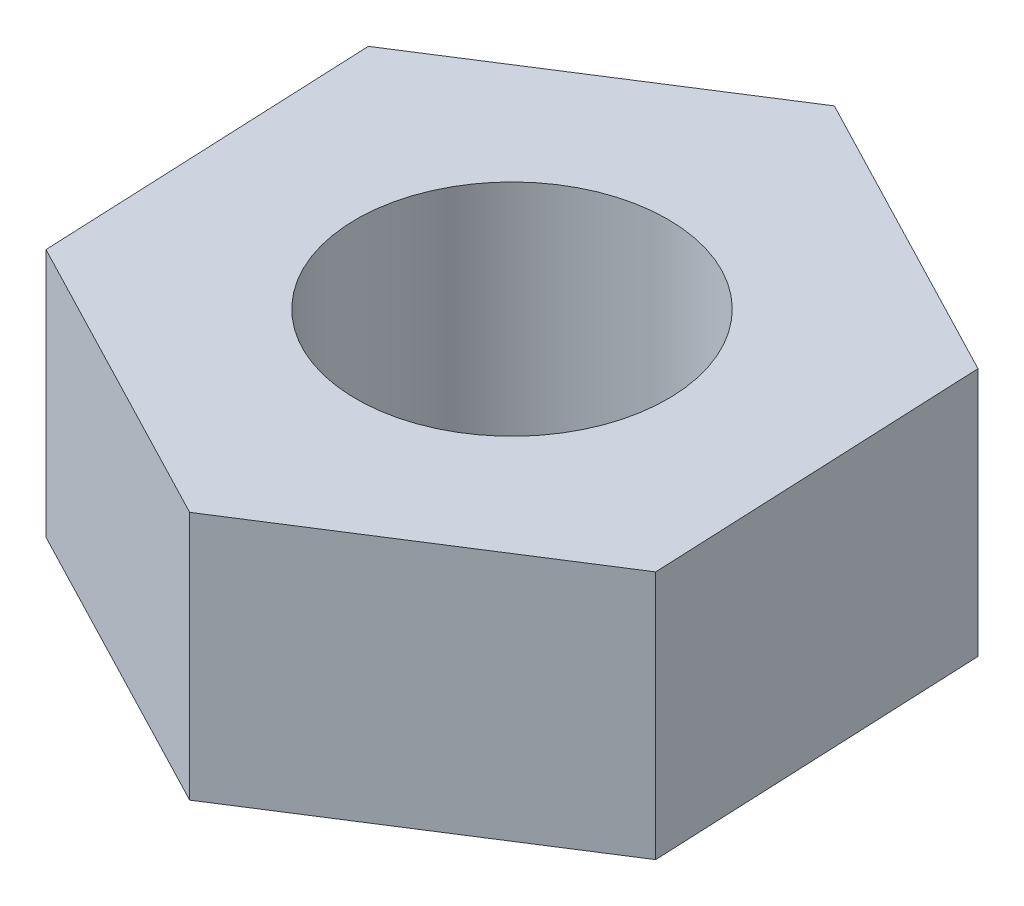
ISO-10303-21;
HEADER;
FILE_DESCRIPTION(('STEP AP214'),'2;1');
FILE_NAME('part.step','',(''),(''),'','','');
FILE_SCHEMA(('AUTOMOTIVE_DESIGN { 1 0 10303 214 1 1 1 1 }'));
ENDSEC;
DATA;
#1=APPLICATION_CONTEXT('core data for automotive mechanical design processes');
#2=APPLICATION_PROTOCOL_DEFINITION('international standard','automotive_design',2000,#1);
#3=PRODUCT_CONTEXT('',#1,'mechanical');
#4=PRODUCT('Part','Part','',(#3));
#5=PRODUCT_RELATED_PRODUCT_CATEGORY('part','',(#4));
#6=PRODUCT_DEFINITION_FORMATION('','',#4);
#7=PRODUCT_DEFINITION_CONTEXT('part definition',#1,'design');
#8=PRODUCT_DEFINITION('design','',#6,#7);
#9=PRODUCT_DEFINITION_SHAPE('','',#8);
#10=(LENGTH_UNIT() NAMED_UNIT(*) SI_UNIT(.MILLI.,.METRE.));
#11=(NAMED_UNIT(*) PLANE_ANGLE_UNIT() SI_UNIT($,.RADIAN.));
#12=(NAMED_UNIT(*) SI_UNIT($,.STERADIAN.) SOLID_ANGLE_UNIT());
#13=UNCERTAINTY_MEASURE_WITH_UNIT(LENGTH_MEASURE(1.E-05),#10,'distance_accuracy_value','');
#14=(GEOMETRIC_REPRESENTATION_CONTEXT(3) GLOBAL_UNCERTAINTY_ASSIGNED_CONTEXT((#13)) GLOBAL_UNIT_ASSIGNED_CONTEXT((#10,
#11,#12)) REPRESENTATION_CONTEXT('',''));
#15=CARTESIAN_POINT('',(0.,0.,0.));
#16=DIRECTION('',(0.,0.,1.));
#17=DIRECTION('',(1.,0.,0.));
#18=AXIS2_PLACEMENT_3D('',#15,#16,#17);
#19=CARTESIAN_POINT('',(-0.285815994218681,4.8,-6.49371305321147));
#20=DIRECTION('',(-0.461435786892992,0.,0.887173610165702));
#21=DIRECTION('',(-0.887173610165703,0.,-0.461435786892992));
#22=AXIS2_PLACEMENT_3D('',#19,#20,#21);
#23=PLANE('',#22);
#24=DIRECTION('',(0.887173610165702,0.,0.461435786892992));
#25=VECTOR('',#24,1.);
#26=CARTESIAN_POINT('',(-0.285815994218681,0.,-6.49371305321147));
#27=LINE('',#26,#25);
#28=CARTESIAN_POINT('',(-0.285815994218681,0.,-6.49371305321147));
#29=VERTEX_POINT('',#28);
#30=CARTESIAN_POINT('',(5.4808124718584,0.,-3.49438043840702));
#31=VERTEX_POINT('',#30);
#32=EDGE_CURVE('E119',#29,#31,#27,.T.);
#33=ORIENTED_EDGE('',*,*,#32,.F.);
#34=DIRECTION('',(0.,-1.,0.));
#35=VECTOR('',#34,1.);
#36=CARTESIAN_POINT('',(-0.285815994218681,4.8,-6.49371305321147));
#37=LINE('',#36,#35);
#38=CARTESIAN_POINT('',(-0.285815994218681,4.8,-6.49371305321147));
#39=VERTEX_POINT('',#38);
#40=EDGE_CURVE('E118',#39,#29,#37,.T.);
#41=ORIENTED_EDGE('',*,*,#40,.F.);
#42=DIRECTION('',(0.887173610165702,0.,0.461435786892992));
#43=VECTOR('',#42,1.);
#44=CARTESIAN_POINT('',(-0.285815994218681,4.8,-6.49371305321147));
#45=LINE('',#44,#43);
#46=CARTESIAN_POINT('',(5.4808124718584,4.8,-3.49438043840702));
#47=VERTEX_POINT('',#46);
#48=EDGE_CURVE('E131',#39,#47,#45,.T.);
#49=ORIENTED_EDGE('',*,*,#48,.T.);
#50=DIRECTION('',(0.,-1.,0.));
#51=VECTOR('',#50,1.);
#52=CARTESIAN_POINT('',(5.4808124718584,4.8,-3.49438043840702));
#53=LINE('',#52,#51);
#54=EDGE_CURVE('E11',#47,#31,#53,.T.);
#55=ORIENTED_EDGE('',*,*,#54,.T.);
#56=EDGE_LOOP('',(#33,#41,#49,#55));
#57=FACE_BOUND('',#56,.T.);
#58=ADVANCED_FACE('F35',(#57),#23,.F.);
#59=CARTESIAN_POINT('',(5.4808124718584,4.8,-3.49438043840702));
#60=DIRECTION('',(-0.999032777417146,0.,0.0439716914182564));
#61=DIRECTION('',(-0.0439716914182564,0.,-0.999032777417147));
#62=AXIS2_PLACEMENT_3D('',#59,#60,#61);
#63=PLANE('',#62);
#64=DIRECTION('',(0.0439716914182564,0.,0.999032777417146));
#65=VECTOR('',#64,1.);
#66=CARTESIAN_POINT('',(5.4808124718584,0.,-3.49438043840702));
#67=LINE('',#66,#65);
#68=CARTESIAN_POINT('',(5.76662846607707,0.,2.99933261480445));
#69=VERTEX_POINT('',#68);
#70=EDGE_CURVE('E121',#31,#69,#67,.T.);
#71=ORIENTED_EDGE('',*,*,#70,.F.);
#72=ORIENTED_EDGE('',*,*,#54,.F.);
#73=DIRECTION('',(0.0439716914182564,0.,0.999032777417146));
#74=VECTOR('',#73,1.);
#75=CARTESIAN_POINT('',(5.4808124718584,4.8,-3.49438043840702));
#76=LINE('',#75,#74);
#77=CARTESIAN_POINT('',(5.76662846607707,4.8,2.99933261480445));
#78=VERTEX_POINT('',#77);
#79=EDGE_CURVE('E84',#47,#78,#76,.T.);
#80=ORIENTED_EDGE('',*,*,#79,.T.);
#81=DIRECTION('',(0.,-1.,0.));
#82=VECTOR('',#81,1.);
#83=CARTESIAN_POINT('',(5.76662846607707,4.8,2.99933261480445));
#84=LINE('',#83,#82);
#85=EDGE_CURVE('E44',#78,#69,#84,.T.);
#86=ORIENTED_EDGE('',*,*,#85,.T.);
#87=EDGE_LOOP('',(#71,#72,#80,#86));
#88=FACE_BOUND('',#87,.T.);
#89=ADVANCED_FACE('F138',(#88),#63,.F.);
#90=CARTESIAN_POINT('',(5.76662846607707,4.8,2.99933261480445));
#91=DIRECTION('',(-0.537596990524155,0.,-0.843201918747444));
#92=DIRECTION('',(0.843201918747444,0.,-0.537596990524155));
#93=AXIS2_PLACEMENT_3D('',#90,#91,#92);
#94=PLANE('',#93);
#95=DIRECTION('',(-0.843201918747444,0.,0.537596990524155));
#96=VECTOR('',#95,1.);
#97=CARTESIAN_POINT('',(5.76662846607707,0.,2.99933261480445));
#98=LINE('',#97,#96);
#99=CARTESIAN_POINT('',(0.285815994218677,0.,6.49371305321146));
#100=VERTEX_POINT('',#99);
#101=EDGE_CURVE('E124',#69,#100,#98,.T.);
#102=ORIENTED_EDGE('',*,*,#101,.F.);
#103=ORIENTED_EDGE('',*,*,#85,.F.);
#104=DIRECTION('',(-0.843201918747444,0.,0.537596990524155));
#105=VECTOR('',#104,1.);
#106=CARTESIAN_POINT('',(5.76662846607707,4.8,2.99933261480445));
#107=LINE('',#106,#105);
#108=CARTESIAN_POINT('',(0.285815994218677,4.8,6.49371305321146));
#109=VERTEX_POINT('',#108);
#110=EDGE_CURVE('E112',#78,#109,#107,.T.);
#111=ORIENTED_EDGE('',*,*,#110,.T.);
#112=DIRECTION('',(0.,-1.,0.));
#113=VECTOR('',#112,1.);
#114=CARTESIAN_POINT('',(0.285815994218677,4.8,6.49371305321146));
#115=LINE('',#114,#113);
#116=EDGE_CURVE('E106',#109,#100,#115,.T.);
#117=ORIENTED_EDGE('',*,*,#116,.T.);
#118=EDGE_LOOP('',(#102,#103,#111,#117));
#119=FACE_BOUND('',#118,.T.);
#120=ADVANCED_FACE('F171',(#119),#94,.F.);
#121=CARTESIAN_POINT('',(0.285815994218677,4.8,6.49371305321146));
#122=DIRECTION('',(0.461435786892992,0.,-0.887173610165702));
#123=DIRECTION('',(0.887173610165702,0.,0.461435786892992));
#124=AXIS2_PLACEMENT_3D('',#121,#122,#123);
#125=PLANE('',#124);
#126=DIRECTION('',(-0.887173610165702,0.,-0.461435786892992));
#127=VECTOR('',#126,1.);
#128=CARTESIAN_POINT('',(0.285815994218677,0.,6.49371305321146));
#129=LINE('',#128,#127);
#130=CARTESIAN_POINT('',(-5.48081247185839,0.,3.49438043840701));
#131=VERTEX_POINT('',#130);
#132=EDGE_CURVE('E127',#100,#131,#129,.T.);
#133=ORIENTED_EDGE('',*,*,#132,.F.);
#134=ORIENTED_EDGE('',*,*,#116,.F.);
#135=DIRECTION('',(-0.887173610165702,0.,-0.461435786892992));
#136=VECTOR('',#135,1.);
#137=CARTESIAN_POINT('',(0.285815994218677,4.8,6.49371305321146));
#138=LINE('',#137,#136);
#139=CARTESIAN_POINT('',(-5.48081247185839,4.8,3.49438043840701));
#140=VERTEX_POINT('',#139);
#141=EDGE_CURVE('E96',#109,#140,#138,.T.);
#142=ORIENTED_EDGE('',*,*,#141,.T.);
#143=DIRECTION('',(0.,-1.,0.));
#144=VECTOR('',#143,1.);
#145=CARTESIAN_POINT('',(-5.48081247185839,4.8,3.49438043840701));
#146=LINE('',#145,#144);
#147=EDGE_CURVE('E101',#140,#131,#146,.T.);
#148=ORIENTED_EDGE('',*,*,#147,.T.);
#149=EDGE_LOOP('',(#133,#134,#142,#148));
#150=FACE_BOUND('',#149,.T.);
#151=ADVANCED_FACE('F109',(#150),#125,.F.);
#152=CARTESIAN_POINT('',(-5.48081247185839,4.8,3.49438043840701));
#153=DIRECTION('',(0.999032777417146,0.,-0.0439716914182575));
#154=DIRECTION('',(0.0439716914182575,0.,0.999032777417146));
#155=AXIS2_PLACEMENT_3D('',#152,#153,#154);
#156=PLANE('',#155);
#157=DIRECTION('',(-0.0439716914182575,0.,-0.999032777417146));
#158=VECTOR('',#157,1.);
#159=CARTESIAN_POINT('',(-5.48081247185839,0.,3.49438043840701));
#160=LINE('',#159,#158);
#161=CARTESIAN_POINT('',(-5.76662846607707,0.,-2.99933261480446));
#162=VERTEX_POINT('',#161);
#163=EDGE_CURVE('E103',#131,#162,#160,.T.);
#164=ORIENTED_EDGE('',*,*,#163,.F.);
#165=ORIENTED_EDGE('',*,*,#147,.F.);
#166=DIRECTION('',(-0.0439716914182575,0.,-0.999032777417146));
#167=VECTOR('',#166,1.);
#168=CARTESIAN_POINT('',(-5.48081247185839,4.8,3.49438043840701));
#169=LINE('',#168,#167);
#170=CARTESIAN_POINT('',(-5.76662846607707,4.8,-2.99933261480446));
#171=VERTEX_POINT('',#170);
#172=EDGE_CURVE('E92',#140,#171,#169,.T.);
#173=ORIENTED_EDGE('',*,*,#172,.T.);
#174=DIRECTION('',(0.,-1.,0.));
#175=VECTOR('',#174,1.);
#176=CARTESIAN_POINT('',(-5.76662846607707,4.8,-2.99933261480446));
#177=LINE('',#176,#175);
#178=EDGE_CURVE('E107',#171,#162,#177,.T.);
#179=ORIENTED_EDGE('',*,*,#178,.T.);
#180=EDGE_LOOP('',(#164,#165,#173,#179));
#181=FACE_BOUND('',#180,.T.);
#182=ADVANCED_FACE('F102',(#181),#156,.F.);
#183=CARTESIAN_POINT('',(-5.76662846607707,4.8,-2.99933261480446));
#184=DIRECTION('',(0.537596990524156,0.,0.843201918747444));
#185=DIRECTION('',(-0.843201918747444,0.,0.537596990524156));
#186=AXIS2_PLACEMENT_3D('',#183,#184,#185);
#187=PLANE('',#186);
#188=DIRECTION('',(0.843201918747444,0.,-0.537596990524156));
#189=VECTOR('',#188,1.);
#190=CARTESIAN_POINT('',(-5.76662846607707,0.,-2.99933261480446));
#191=LINE('',#190,#189);
#192=EDGE_CURVE('E72',#162,#29,#191,.T.);
#193=ORIENTED_EDGE('',*,*,#192,.F.);
#194=ORIENTED_EDGE('',*,*,#178,.F.);
#195=DIRECTION('',(0.843201918747444,0.,-0.537596990524156));
#196=VECTOR('',#195,1.);
#197=CARTESIAN_POINT('',(-5.76662846607707,4.8,-2.99933261480446));
#198=LINE('',#197,#196);
#199=EDGE_CURVE('E52',#171,#39,#198,.T.);
#200=ORIENTED_EDGE('',*,*,#199,.T.);
#201=ORIENTED_EDGE('',*,*,#40,.T.);
#202=EDGE_LOOP('',(#193,#194,#200,#201));
#203=FACE_BOUND('',#202,.T.);
#204=ADVANCED_FACE('F164',(#203),#187,.F.);
#205=CARTESIAN_POINT('',(0.,4.8,0.));
#206=DIRECTION('',(0.,1.,0.));
#207=DIRECTION('',(0.,0.,-1.));
#208=AXIS2_PLACEMENT_3D('',#205,#206,#207);
#209=PLANE('',#208);
#210=CARTESIAN_POINT('',(0.,4.8,0.));
#211=DIRECTION('',(0.,-1.,0.));
#212=DIRECTION('',(0.,0.,-1.));
#213=AXIS2_PLACEMENT_3D('',#210,#211,#212);
#214=CIRCLE('',#213,3.);
#215=CARTESIAN_POINT('',(0.,4.8,-3.));
#216=VERTEX_POINT('',#215);
#217=EDGE_CURVE('E147',#216,#216,#214,.T.);
#218=ORIENTED_EDGE('',*,*,#217,.T.);
#219=EDGE_LOOP('',(#218));
#220=FACE_BOUND('',#219,.T.);
#221=ORIENTED_EDGE('',*,*,#48,.F.);
#222=ORIENTED_EDGE('',*,*,#199,.F.);
#223=ORIENTED_EDGE('',*,*,#172,.F.);
#224=ORIENTED_EDGE('',*,*,#141,.F.);
#225=ORIENTED_EDGE('',*,*,#110,.F.);
#226=ORIENTED_EDGE('',*,*,#79,.F.);
#227=EDGE_LOOP('',(#221,#222,#223,#224,#225,#226));
#228=FACE_BOUND('',#227,.T.);
#229=ADVANCED_FACE('F94',(#220,#228),#209,.T.);
#230=CARTESIAN_POINT('',(0.,0.,0.));
#231=DIRECTION('',(0.,1.,0.));
#232=DIRECTION('',(0.,0.,-1.));
#233=AXIS2_PLACEMENT_3D('',#230,#231,#232);
#234=PLANE('',#233);
#235=CARTESIAN_POINT('',(0.,0.,0.));
#236=DIRECTION('',(0.,-1.,0.));
#237=DIRECTION('',(0.,0.,-1.));
#238=AXIS2_PLACEMENT_3D('',#235,#236,#237);
#239=CIRCLE('',#238,3.);
#240=CARTESIAN_POINT('',(0.,0.,-3.));
#241=VERTEX_POINT('',#240);
#242=EDGE_CURVE('E38',#241,#241,#239,.T.);
#243=ORIENTED_EDGE('',*,*,#242,.F.);
#244=EDGE_LOOP('',(#243));
#245=FACE_BOUND('',#244,.T.);
#246=ORIENTED_EDGE('',*,*,#32,.T.);
#247=ORIENTED_EDGE('',*,*,#70,.T.);
#248=ORIENTED_EDGE('',*,*,#101,.T.);
#249=ORIENTED_EDGE('',*,*,#132,.T.);
#250=ORIENTED_EDGE('',*,*,#163,.T.);
#251=ORIENTED_EDGE('',*,*,#192,.T.);
#252=EDGE_LOOP('',(#246,#247,#248,#249,#250,#251));
#253=FACE_BOUND('',#252,.T.);
#254=ADVANCED_FACE('F140',(#245,#253),#234,.F.);
#255=CARTESIAN_POINT('',(0.,-0.7,0.));
#256=DIRECTION('',(0.,1.,0.));
#257=DIRECTION('',(0.,0.,-1.));
#258=AXIS2_PLACEMENT_3D('',#255,#256,#257);
#259=CYLINDRICAL_SURFACE('',#258,3.);
#260=ORIENTED_EDGE('',*,*,#217,.F.);
#261=EDGE_LOOP('',(#260));
#262=FACE_BOUND('',#261,.T.);
#263=ORIENTED_EDGE('',*,*,#242,.T.);
#264=EDGE_LOOP('',(#263));
#265=FACE_BOUND('',#264,.T.);
#266=ADVANCED_FACE('F154',(#262,#265),#259,.F.);
#267=CLOSED_SHELL('',(#58,#89,#120,#151,#182,#204,#229,#254,#266));
#268=MANIFOLD_SOLID_BREP('B2',#267);
#269=ADVANCED_BREP_SHAPE_REPRESENTATION('',(#18,#268),#14);
#270=SHAPE_DEFINITION_REPRESENTATION(#9,#269);
ENDSEC;
END-ISO-10303-21;
